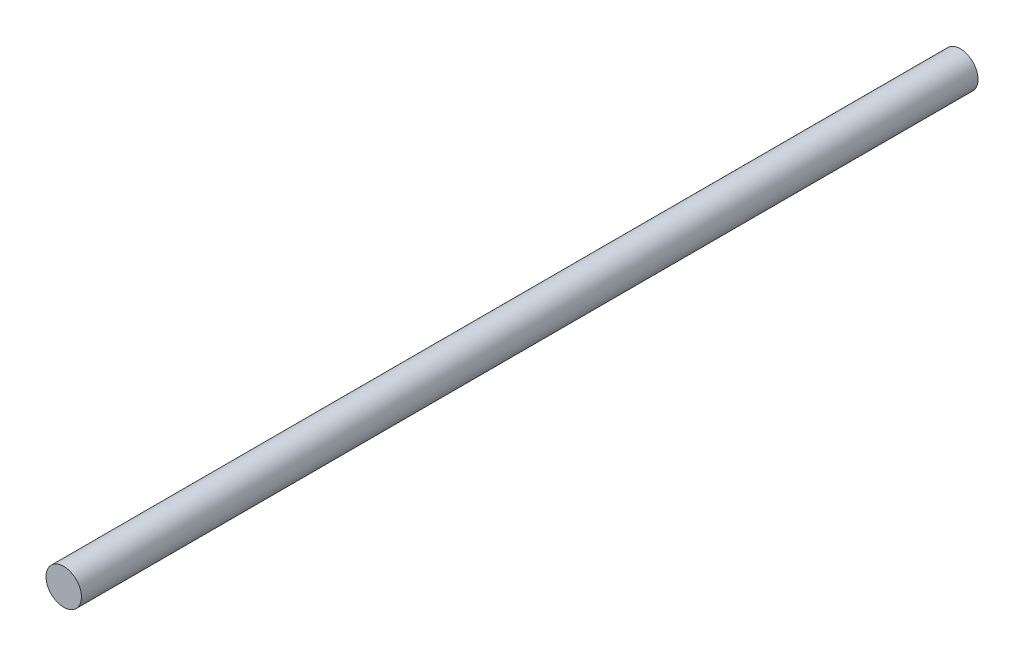
ISO-10303-21;
HEADER;
FILE_DESCRIPTION(('STEP AP214'),'2;1');
FILE_NAME('part.step','',(''),(''),'','','');
FILE_SCHEMA(('AUTOMOTIVE_DESIGN { 1 0 10303 214 1 1 1 1 }'));
ENDSEC;
DATA;
#1=APPLICATION_CONTEXT('core data for automotive mechanical design processes');
#2=APPLICATION_PROTOCOL_DEFINITION('international standard','automotive_design',2000,#1);
#3=PRODUCT_CONTEXT('',#1,'mechanical');
#4=PRODUCT('Part','Part','',(#3));
#5=PRODUCT_RELATED_PRODUCT_CATEGORY('part','',(#4));
#6=PRODUCT_DEFINITION_FORMATION('','',#4);
#7=PRODUCT_DEFINITION_CONTEXT('part definition',#1,'design');
#8=PRODUCT_DEFINITION('design','',#6,#7);
#9=PRODUCT_DEFINITION_SHAPE('','',#8);
#10=(LENGTH_UNIT() NAMED_UNIT(*) SI_UNIT(.MILLI.,.METRE.));
#11=(NAMED_UNIT(*) PLANE_ANGLE_UNIT() SI_UNIT($,.RADIAN.));
#12=(NAMED_UNIT(*) SI_UNIT($,.STERADIAN.) SOLID_ANGLE_UNIT());
#13=UNCERTAINTY_MEASURE_WITH_UNIT(LENGTH_MEASURE(1.E-05),#10,'distance_accuracy_value','');
#14=(GEOMETRIC_REPRESENTATION_CONTEXT(3) GLOBAL_UNCERTAINTY_ASSIGNED_CONTEXT((#13)) GLOBAL_UNIT_ASSIGNED_CONTEXT((#10,
#11,#12)) REPRESENTATION_CONTEXT('',''));
#15=CARTESIAN_POINT('',(0.,0.,0.));
#16=DIRECTION('',(0.,0.,1.));
#17=DIRECTION('',(1.,0.,0.));
#18=AXIS2_PLACEMENT_3D('',#15,#16,#17);
#19=CARTESIAN_POINT('',(12.28,28.32,310.83));
#20=DIRECTION('',(0.,0.,-1.));
#21=DIRECTION('',(-1.,0.,0.));
#22=AXIS2_PLACEMENT_3D('',#19,#20,#21);
#23=CYLINDRICAL_SURFACE('',#22,6.025);
#24=CARTESIAN_POINT('',(12.28,28.32,310.83));
#25=DIRECTION('',(0.,0.,1.));
#26=DIRECTION('',(1.,0.,0.));
#27=AXIS2_PLACEMENT_3D('',#24,#25,#26);
#28=CIRCLE('',#27,6.025);
#29=CARTESIAN_POINT('',(6.255,28.32,310.83));
#30=VERTEX_POINT('',#29);
#31=EDGE_CURVE('E10',#30,#30,#28,.T.);
#32=CARTESIAN_POINT('',(12.28,28.32,6.03));
#33=DIRECTION('',(0.,0.,1.));
#34=DIRECTION('',(1.,0.,0.));
#35=AXIS2_PLACEMENT_3D('',#32,#33,#34);
#36=CIRCLE('',#35,6.025);
#37=CARTESIAN_POINT('',(6.255,28.32,6.02999999999998));
#38=VERTEX_POINT('',#37);
#39=EDGE_CURVE('E46',#38,#38,#36,.T.);
#40=CARTESIAN_POINT('',(6.255,28.32,310.83));
#41=CARTESIAN_POINT('',(6.255,28.32,307.655));
#42=CARTESIAN_POINT('',(6.255,28.32,304.48));
#43=CARTESIAN_POINT('',(6.255,28.32,298.13));
#44=CARTESIAN_POINT('',(6.255,28.32,294.955));
#45=CARTESIAN_POINT('',(6.255,28.32,288.605));
#46=CARTESIAN_POINT('',(6.255,28.32,285.43));
#47=CARTESIAN_POINT('',(6.255,28.32,279.08));
#48=CARTESIAN_POINT('',(6.255,28.32,275.905));
#49=CARTESIAN_POINT('',(6.255,28.32,269.555));
#50=CARTESIAN_POINT('',(6.255,28.32,266.38));
#51=CARTESIAN_POINT('',(6.255,28.32,260.03));
#52=CARTESIAN_POINT('',(6.255,28.32,256.855));
#53=CARTESIAN_POINT('',(6.255,28.32,250.505));
#54=CARTESIAN_POINT('',(6.255,28.32,247.33));
#55=CARTESIAN_POINT('',(6.255,28.32,240.98));
#56=CARTESIAN_POINT('',(6.255,28.32,237.805));
#57=CARTESIAN_POINT('',(6.255,28.32,231.455));
#58=CARTESIAN_POINT('',(6.255,28.32,228.28));
#59=CARTESIAN_POINT('',(6.255,28.32,221.93));
#60=CARTESIAN_POINT('',(6.255,28.32,218.755));
#61=CARTESIAN_POINT('',(6.255,28.32,212.405));
#62=CARTESIAN_POINT('',(6.255,28.32,209.23));
#63=CARTESIAN_POINT('',(6.255,28.32,202.88));
#64=CARTESIAN_POINT('',(6.255,28.32,199.705));
#65=CARTESIAN_POINT('',(6.255,28.32,193.355));
#66=CARTESIAN_POINT('',(6.255,28.32,190.18));
#67=CARTESIAN_POINT('',(6.255,28.32,183.83));
#68=CARTESIAN_POINT('',(6.255,28.32,180.655));
#69=CARTESIAN_POINT('',(6.255,28.32,174.305));
#70=CARTESIAN_POINT('',(6.255,28.32,171.13));
#71=CARTESIAN_POINT('',(6.255,28.32,164.78));
#72=CARTESIAN_POINT('',(6.255,28.32,161.605));
#73=CARTESIAN_POINT('',(6.255,28.32,155.255));
#74=CARTESIAN_POINT('',(6.255,28.32,152.08));
#75=CARTESIAN_POINT('',(6.255,28.32,145.73));
#76=CARTESIAN_POINT('',(6.255,28.32,142.555));
#77=CARTESIAN_POINT('',(6.255,28.32,136.205));
#78=CARTESIAN_POINT('',(6.255,28.32,133.03));
#79=CARTESIAN_POINT('',(6.255,28.32,126.68));
#80=CARTESIAN_POINT('',(6.255,28.32,123.505));
#81=CARTESIAN_POINT('',(6.255,28.32,117.155));
#82=CARTESIAN_POINT('',(6.255,28.32,113.98));
#83=CARTESIAN_POINT('',(6.255,28.32,107.63));
#84=CARTESIAN_POINT('',(6.255,28.32,104.455));
#85=CARTESIAN_POINT('',(6.255,28.32,98.105));
#86=CARTESIAN_POINT('',(6.255,28.32,94.9299999999999));
#87=CARTESIAN_POINT('',(6.255,28.32,88.58));
#88=CARTESIAN_POINT('',(6.255,28.32,85.4049999999999));
#89=CARTESIAN_POINT('',(6.255,28.32,79.0549999999999));
#90=CARTESIAN_POINT('',(6.255,28.32,75.8799999999999));
#91=CARTESIAN_POINT('',(6.255,28.32,69.5299999999999));
#92=CARTESIAN_POINT('',(6.255,28.32,66.3549999999999));
#93=CARTESIAN_POINT('',(6.255,28.32,60.005));
#94=CARTESIAN_POINT('',(6.255,28.32,56.83));
#95=CARTESIAN_POINT('',(6.255,28.32,50.48));
#96=CARTESIAN_POINT('',(6.255,28.32,47.305));
#97=CARTESIAN_POINT('',(6.255,28.32,40.955));
#98=CARTESIAN_POINT('',(6.255,28.32,37.78));
#99=CARTESIAN_POINT('',(6.255,28.32,31.43));
#100=CARTESIAN_POINT('',(6.255,28.32,28.255));
#101=CARTESIAN_POINT('',(6.255,28.32,21.905));
#102=CARTESIAN_POINT('',(6.255,28.32,18.73));
#103=CARTESIAN_POINT('',(6.255,28.32,12.38));
#104=CARTESIAN_POINT('',(6.255,28.32,9.20499999999998));
#105=CARTESIAN_POINT('',(6.255,28.32,6.02999999999998));
#106=B_SPLINE_CURVE_WITH_KNOTS('',3,(#40,#41,#42,#43,#44,#45,#46,#47,#48,#49,#50,#51,#52,#53,
#54,#55,#56,#57,#58,#59,#60,#61,#62,#63,#64,#65,#66,#67,#68,#69,#70,#71,#72,#73,#74,#75,#76,#77,
#78,#79,#80,#81,#82,#83,#84,#85,#86,#87,#88,#89,#90,#91,#92,#93,#94,#95,#96,#97,#98,#99,#100,
#101,#102,#103,#104,#105),.UNSPECIFIED.,.F.,.F.,(4,2,2,2,2,2,2,2,2,2,2,2,2,2,2,2,2,2,2,2,2,2,2,
2,2,2,2,2,2,2,2,2,4),(0.,9.52500000000001,19.05,28.575,38.1,47.625,57.15,66.675,76.2,
85.7250000000001,95.2500000000001,104.775,114.3,123.825,133.35,142.875,152.4,161.925,171.45,
180.975,190.5,200.025,209.55,219.075,228.6,238.125,247.65,257.175,266.7,276.225,285.75,295.275,
304.8),.UNSPECIFIED.);
#107=EDGE_CURVE('BSEAM43',#30,#38,#106,.T.);
#108=ORIENTED_EDGE('',*,*,#31,.F.);
#109=ORIENTED_EDGE('',*,*,#39,.T.);
#110=ORIENTED_EDGE('',*,*,#107,.T.);
#111=ORIENTED_EDGE('',*,*,#107,.F.);
#112=EDGE_LOOP('',(#108,#110,#109,#111));
#113=FACE_BOUND('',#112,.T.);
#114=ADVANCED_FACE('F43',(#113),#23,.T.);
#115=CARTESIAN_POINT('',(12.28,28.32,310.83));
#116=DIRECTION('',(0.,0.,1.));
#117=DIRECTION('',(1.,0.,0.));
#118=AXIS2_PLACEMENT_3D('',#115,#116,#117);
#119=PLANE('',#118);
#120=ORIENTED_EDGE('',*,*,#31,.T.);
#121=EDGE_LOOP('',(#120));
#122=FACE_BOUND('',#121,.T.);
#123=ADVANCED_FACE('F60',(#122),#119,.T.);
#124=CARTESIAN_POINT('',(12.28,28.32,6.03));
#125=DIRECTION('',(0.,0.,1.));
#126=DIRECTION('',(1.,0.,0.));
#127=AXIS2_PLACEMENT_3D('',#124,#125,#126);
#128=PLANE('',#127);
#129=ORIENTED_EDGE('',*,*,#39,.F.);
#130=EDGE_LOOP('',(#129));
#131=FACE_BOUND('',#130,.T.);
#132=ADVANCED_FACE('F58',(#131),#128,.F.);
#133=CLOSED_SHELL('',(#114,#123,#132));
#134=MANIFOLD_SOLID_BREP('B2',#133);
#135=ADVANCED_BREP_SHAPE_REPRESENTATION('',(#18,#134),#14);
#136=SHAPE_DEFINITION_REPRESENTATION(#9,#135);
ENDSEC;
END-ISO-10303-21;
